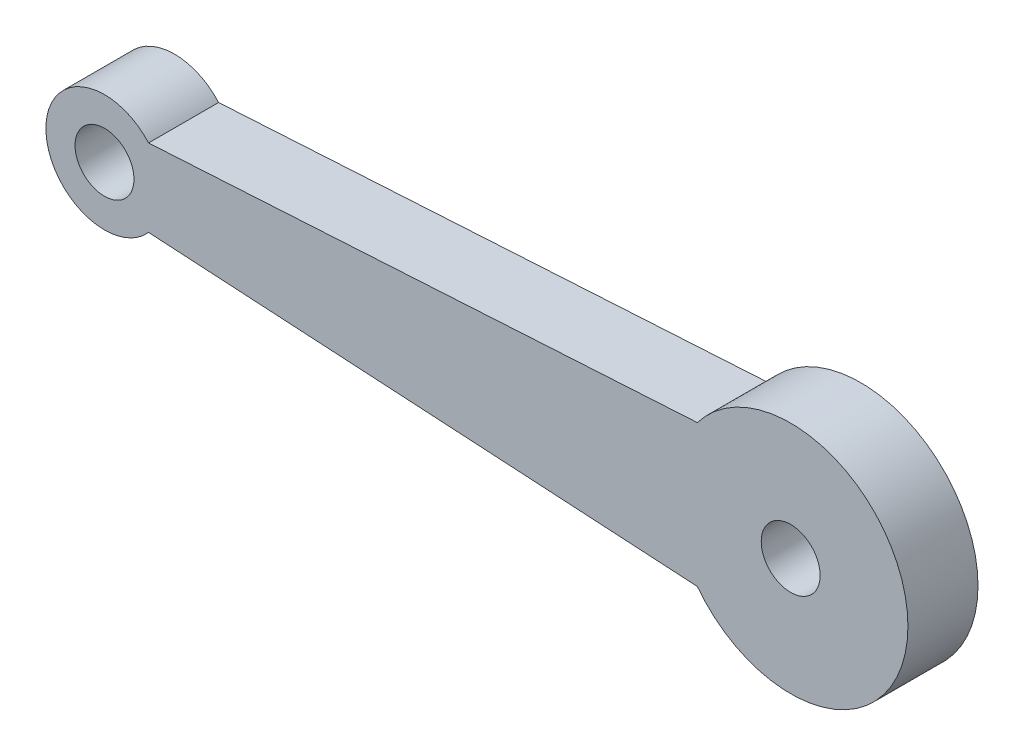
ISO-10303-21;
HEADER;
FILE_DESCRIPTION(('STEP AP214'),'2;1');
FILE_NAME('part.step','',(''),(''),'','','');
FILE_SCHEMA(('AUTOMOTIVE_DESIGN { 1 0 10303 214 1 1 1 1 }'));
ENDSEC;
DATA;
#1=APPLICATION_CONTEXT('core data for automotive mechanical design processes');
#2=APPLICATION_PROTOCOL_DEFINITION('international standard','automotive_design',2000,#1);
#3=PRODUCT_CONTEXT('',#1,'mechanical');
#4=PRODUCT('Part','Part','',(#3));
#5=PRODUCT_RELATED_PRODUCT_CATEGORY('part','',(#4));
#6=PRODUCT_DEFINITION_FORMATION('','',#4);
#7=PRODUCT_DEFINITION_CONTEXT('part definition',#1,'design');
#8=PRODUCT_DEFINITION('design','',#6,#7);
#9=PRODUCT_DEFINITION_SHAPE('','',#8);
#10=(LENGTH_UNIT() NAMED_UNIT(*) SI_UNIT(.MILLI.,.METRE.));
#11=(NAMED_UNIT(*) PLANE_ANGLE_UNIT() SI_UNIT($,.RADIAN.));
#12=(NAMED_UNIT(*) SI_UNIT($,.STERADIAN.) SOLID_ANGLE_UNIT());
#13=UNCERTAINTY_MEASURE_WITH_UNIT(LENGTH_MEASURE(1.E-05),#10,'distance_accuracy_value','');
#14=(GEOMETRIC_REPRESENTATION_CONTEXT(3) GLOBAL_UNCERTAINTY_ASSIGNED_CONTEXT((#13)) GLOBAL_UNIT_ASSIGNED_CONTEXT((#10,
#11,#12)) REPRESENTATION_CONTEXT('',''));
#15=CARTESIAN_POINT('',(0.,0.,0.));
#16=DIRECTION('',(0.,0.,1.));
#17=DIRECTION('',(1.,0.,0.));
#18=AXIS2_PLACEMENT_3D('',#15,#16,#17);
#19=CARTESIAN_POINT('',(62.4114340365097,0.,11.95));
#20=DIRECTION('',(0.,0.,1.));
#21=DIRECTION('',(1.,0.,0.));
#22=AXIS2_PLACEMENT_3D('',#19,#20,#21);
#23=PLANE('',#22);
#24=CARTESIAN_POINT('',(-54.6218791034903,0.,11.95));
#25=DIRECTION('',(0.,0.,1.));
#26=DIRECTION('',(1.,0.,0.));
#27=AXIS2_PLACEMENT_3D('',#24,#25,#26);
#28=CIRCLE('',#27,5.025);
#29=CARTESIAN_POINT('',(-59.6468791034903,0.,11.95));
#30=VERTEX_POINT('',#29);
#31=EDGE_CURVE('E101',#30,#30,#28,.T.);
#32=ORIENTED_EDGE('',*,*,#31,.F.);
#33=EDGE_LOOP('',(#32));
#34=FACE_BOUND('',#33,.T.);
#35=CARTESIAN_POINT('',(62.4114340365097,0.,11.95));
#36=DIRECTION('',(0.,0.,1.));
#37=DIRECTION('',(1.,0.,0.));
#38=AXIS2_PLACEMENT_3D('',#35,#36,#37);
#39=CIRCLE('',#38,20.);
#40=CARTESIAN_POINT('',(46.4909134998335,-12.1052478636858,11.95));
#41=VERTEX_POINT('',#40);
#42=CARTESIAN_POINT('',(46.4909134998335,12.1052478636858,11.95));
#43=VERTEX_POINT('',#42);
#44=EDGE_CURVE('E86',#41,#43,#39,.T.);
#45=ORIENTED_EDGE('',*,*,#44,.T.);
#46=DIRECTION('',(-0.998278196836834,-0.058656983558639,0.));
#47=VECTOR('',#46,1.);
#48=CARTESIAN_POINT('',(46.4909134998335,12.1052478636858,11.95));
#49=LINE('',#48,#47);
#50=CARTESIAN_POINT('',(-47.1138013339103,6.60520765804821,11.95));
#51=VERTEX_POINT('',#50);
#52=EDGE_CURVE('E81',#43,#51,#49,.T.);
#53=ORIENTED_EDGE('',*,*,#52,.T.);
#54=CARTESIAN_POINT('',(-54.6218791034903,0.,11.95));
#55=DIRECTION('',(0.,0.,1.));
#56=DIRECTION('',(1.,0.,0.));
#57=AXIS2_PLACEMENT_3D('',#54,#55,#56);
#58=CIRCLE('',#57,10.);
#59=CARTESIAN_POINT('',(-47.1138013339103,-6.60520765804821,11.95));
#60=VERTEX_POINT('',#59);
#61=EDGE_CURVE('E84',#51,#60,#58,.T.);
#62=ORIENTED_EDGE('',*,*,#61,.T.);
#63=DIRECTION('',(0.998278196836834,-0.058656983558639,0.));
#64=VECTOR('',#63,1.);
#65=CARTESIAN_POINT('',(46.4909134998335,-12.1052478636858,11.95));
#66=LINE('',#65,#64);
#67=EDGE_CURVE('E51',#60,#41,#66,.T.);
#68=ORIENTED_EDGE('',*,*,#67,.T.);
#69=EDGE_LOOP('',(#45,#53,#62,#68));
#70=FACE_BOUND('',#69,.T.);
#71=CARTESIAN_POINT('',(62.4114340365097,0.,11.95));
#72=DIRECTION('',(0.,0.,1.));
#73=DIRECTION('',(1.,0.,0.));
#74=AXIS2_PLACEMENT_3D('',#71,#72,#73);
#75=CIRCLE('',#74,5.025);
#76=CARTESIAN_POINT('',(57.3864340365097,0.,11.95));
#77=VERTEX_POINT('',#76);
#78=EDGE_CURVE('E116',#77,#77,#75,.T.);
#79=ORIENTED_EDGE('',*,*,#78,.F.);
#80=EDGE_LOOP('',(#79));
#81=FACE_BOUND('',#80,.T.);
#82=ADVANCED_FACE('F34',(#34,#70,#81),#23,.T.);
#83=CARTESIAN_POINT('',(62.4114340365097,0.,0.));
#84=DIRECTION('',(0.,0.,1.));
#85=DIRECTION('',(1.,0.,0.));
#86=AXIS2_PLACEMENT_3D('',#83,#84,#85);
#87=PLANE('',#86);
#88=CARTESIAN_POINT('',(62.4114340365097,0.,0.));
#89=DIRECTION('',(0.,0.,1.));
#90=DIRECTION('',(1.,0.,0.));
#91=AXIS2_PLACEMENT_3D('',#88,#89,#90);
#92=CIRCLE('',#91,20.);
#93=CARTESIAN_POINT('',(46.4909134998335,-12.1052478636858,0.));
#94=VERTEX_POINT('',#93);
#95=CARTESIAN_POINT('',(46.4909134998335,12.1052478636858,0.));
#96=VERTEX_POINT('',#95);
#97=EDGE_CURVE('E98',#94,#96,#92,.T.);
#98=ORIENTED_EDGE('',*,*,#97,.F.);
#99=DIRECTION('',(0.998278196836834,-0.058656983558639,0.));
#100=VECTOR('',#99,1.);
#101=CARTESIAN_POINT('',(46.4909134998335,-12.1052478636858,0.));
#102=LINE('',#101,#100);
#103=CARTESIAN_POINT('',(-47.1138013339103,-6.60520765804821,0.));
#104=VERTEX_POINT('',#103);
#105=EDGE_CURVE('E74',#104,#94,#102,.T.);
#106=ORIENTED_EDGE('',*,*,#105,.F.);
#107=CARTESIAN_POINT('',(-54.6218791034903,0.,0.));
#108=DIRECTION('',(0.,0.,1.));
#109=DIRECTION('',(1.,0.,0.));
#110=AXIS2_PLACEMENT_3D('',#107,#108,#109);
#111=CIRCLE('',#110,10.);
#112=CARTESIAN_POINT('',(-47.1138013339103,6.60520765804821,0.));
#113=VERTEX_POINT('',#112);
#114=EDGE_CURVE('E68',#113,#104,#111,.T.);
#115=ORIENTED_EDGE('',*,*,#114,.F.);
#116=DIRECTION('',(-0.998278196836834,-0.058656983558639,0.));
#117=VECTOR('',#116,1.);
#118=CARTESIAN_POINT('',(46.4909134998335,12.1052478636858,0.));
#119=LINE('',#118,#117);
#120=EDGE_CURVE('E90',#96,#113,#119,.T.);
#121=ORIENTED_EDGE('',*,*,#120,.F.);
#122=EDGE_LOOP('',(#98,#106,#115,#121));
#123=FACE_BOUND('',#122,.T.);
#124=CARTESIAN_POINT('',(-54.6218791034903,0.,0.));
#125=DIRECTION('',(0.,0.,1.));
#126=DIRECTION('',(1.,0.,0.));
#127=AXIS2_PLACEMENT_3D('',#124,#125,#126);
#128=CIRCLE('',#127,5.025);
#129=CARTESIAN_POINT('',(-59.6468791034903,0.,0.));
#130=VERTEX_POINT('',#129);
#131=EDGE_CURVE('E113',#130,#130,#128,.T.);
#132=ORIENTED_EDGE('',*,*,#131,.T.);
#133=EDGE_LOOP('',(#132));
#134=FACE_BOUND('',#133,.T.);
#135=CARTESIAN_POINT('',(62.4114340365097,0.,0.));
#136=DIRECTION('',(0.,0.,1.));
#137=DIRECTION('',(1.,0.,0.));
#138=AXIS2_PLACEMENT_3D('',#135,#136,#137);
#139=CIRCLE('',#138,5.025);
#140=CARTESIAN_POINT('',(57.3864340365097,0.,0.));
#141=VERTEX_POINT('',#140);
#142=EDGE_CURVE('E119',#141,#141,#139,.T.);
#143=ORIENTED_EDGE('',*,*,#142,.T.);
#144=EDGE_LOOP('',(#143));
#145=FACE_BOUND('',#144,.T.);
#146=ADVANCED_FACE('F109',(#123,#134,#145),#87,.F.);
#147=CARTESIAN_POINT('',(62.4114340365097,0.,11.95));
#148=DIRECTION('',(0.,0.,-1.));
#149=DIRECTION('',(-1.,0.,0.));
#150=AXIS2_PLACEMENT_3D('',#147,#148,#149);
#151=CYLINDRICAL_SURFACE('',#150,20.);
#152=ORIENTED_EDGE('',*,*,#97,.T.);
#153=DIRECTION('',(0.,0.,-1.));
#154=VECTOR('',#153,1.);
#155=CARTESIAN_POINT('',(46.4909134998335,12.1052478636858,11.95));
#156=LINE('',#155,#154);
#157=EDGE_CURVE('E11',#43,#96,#156,.T.);
#158=ORIENTED_EDGE('',*,*,#157,.F.);
#159=ORIENTED_EDGE('',*,*,#44,.F.);
#160=DIRECTION('',(0.,0.,-1.));
#161=VECTOR('',#160,1.);
#162=CARTESIAN_POINT('',(46.4909134998335,-12.1052478636858,11.95));
#163=LINE('',#162,#161);
#164=EDGE_CURVE('E94',#41,#94,#163,.T.);
#165=ORIENTED_EDGE('',*,*,#164,.T.);
#166=EDGE_LOOP('',(#152,#158,#159,#165));
#167=FACE_BOUND('',#166,.T.);
#168=ADVANCED_FACE('F36',(#167),#151,.T.);
#169=CARTESIAN_POINT('',(46.4909134998335,12.1052478636858,11.95));
#170=DIRECTION('',(0.058656983558639,-0.998278196836834,0.));
#171=DIRECTION('',(0.998278196836835,0.058656983558639,0.));
#172=AXIS2_PLACEMENT_3D('',#169,#170,#171);
#173=PLANE('',#172);
#174=ORIENTED_EDGE('',*,*,#120,.T.);
#175=DIRECTION('',(0.,0.,-1.));
#176=VECTOR('',#175,1.);
#177=CARTESIAN_POINT('',(-47.1138013339103,6.60520765804821,11.95));
#178=LINE('',#177,#176);
#179=EDGE_CURVE('E43',#51,#113,#178,.T.);
#180=ORIENTED_EDGE('',*,*,#179,.F.);
#181=ORIENTED_EDGE('',*,*,#52,.F.);
#182=ORIENTED_EDGE('',*,*,#157,.T.);
#183=EDGE_LOOP('',(#174,#180,#181,#182));
#184=FACE_BOUND('',#183,.T.);
#185=ADVANCED_FACE('F89',(#184),#173,.F.);
#186=CARTESIAN_POINT('',(-54.6218791034903,0.,11.95));
#187=DIRECTION('',(0.,0.,-1.));
#188=DIRECTION('',(-1.,0.,0.));
#189=AXIS2_PLACEMENT_3D('',#186,#187,#188);
#190=CYLINDRICAL_SURFACE('',#189,10.);
#191=ORIENTED_EDGE('',*,*,#114,.T.);
#192=DIRECTION('',(0.,0.,-1.));
#193=VECTOR('',#192,1.);
#194=CARTESIAN_POINT('',(-47.1138013339103,-6.60520765804821,11.95));
#195=LINE('',#194,#193);
#196=EDGE_CURVE('E91',#60,#104,#195,.T.);
#197=ORIENTED_EDGE('',*,*,#196,.F.);
#198=ORIENTED_EDGE('',*,*,#61,.F.);
#199=ORIENTED_EDGE('',*,*,#179,.T.);
#200=EDGE_LOOP('',(#191,#197,#198,#199));
#201=FACE_BOUND('',#200,.T.);
#202=ADVANCED_FACE('F92',(#201),#190,.T.);
#203=CARTESIAN_POINT('',(46.4909134998335,-12.1052478636858,11.95));
#204=DIRECTION('',(0.058656983558639,0.998278196836834,0.));
#205=DIRECTION('',(-0.998278196836835,0.058656983558639,0.));
#206=AXIS2_PLACEMENT_3D('',#203,#204,#205);
#207=PLANE('',#206);
#208=ORIENTED_EDGE('',*,*,#105,.T.);
#209=ORIENTED_EDGE('',*,*,#164,.F.);
#210=ORIENTED_EDGE('',*,*,#67,.F.);
#211=ORIENTED_EDGE('',*,*,#196,.T.);
#212=EDGE_LOOP('',(#208,#209,#210,#211));
#213=FACE_BOUND('',#212,.T.);
#214=ADVANCED_FACE('F106',(#213),#207,.F.);
#215=CARTESIAN_POINT('',(-54.6218791034903,0.,11.95));
#216=DIRECTION('',(0.,0.,-1.));
#217=DIRECTION('',(-1.,0.,0.));
#218=AXIS2_PLACEMENT_3D('',#215,#216,#217);
#219=CYLINDRICAL_SURFACE('',#218,5.025);
#220=CARTESIAN_POINT('',(-59.6468791034903,0.,11.95));
#221=CARTESIAN_POINT('',(-59.6468791034903,0.,11.8255208333333));
#222=CARTESIAN_POINT('',(-59.6468791034903,0.,11.7010416666667));
#223=CARTESIAN_POINT('',(-59.6468791034903,0.,11.4520833333333));
#224=CARTESIAN_POINT('',(-59.6468791034903,0.,11.3276041666667));
#225=CARTESIAN_POINT('',(-59.6468791034903,0.,11.0786458333333));
#226=CARTESIAN_POINT('',(-59.6468791034903,0.,10.9541666666667));
#227=CARTESIAN_POINT('',(-59.6468791034903,0.,10.7052083333333));
#228=CARTESIAN_POINT('',(-59.6468791034903,0.,10.5807291666667));
#229=CARTESIAN_POINT('',(-59.6468791034903,0.,10.3317708333333));
#230=CARTESIAN_POINT('',(-59.6468791034903,0.,10.2072916666667));
#231=CARTESIAN_POINT('',(-59.6468791034903,0.,9.95833333333333));
#232=CARTESIAN_POINT('',(-59.6468791034903,0.,9.83385416666667));
#233=CARTESIAN_POINT('',(-59.6468791034903,0.,9.58489583333333));
#234=CARTESIAN_POINT('',(-59.6468791034903,0.,9.46041666666667));
#235=CARTESIAN_POINT('',(-59.6468791034903,0.,9.21145833333333));
#236=CARTESIAN_POINT('',(-59.6468791034903,0.,9.08697916666667));
#237=CARTESIAN_POINT('',(-59.6468791034903,0.,8.83802083333333));
#238=CARTESIAN_POINT('',(-59.6468791034903,0.,8.71354166666666));
#239=CARTESIAN_POINT('',(-59.6468791034903,0.,8.46458333333333));
#240=CARTESIAN_POINT('',(-59.6468791034903,0.,8.34010416666666));
#241=CARTESIAN_POINT('',(-59.6468791034903,0.,8.09114583333333));
#242=CARTESIAN_POINT('',(-59.6468791034903,0.,7.96666666666667));
#243=CARTESIAN_POINT('',(-59.6468791034903,0.,7.71770833333333));
#244=CARTESIAN_POINT('',(-59.6468791034903,0.,7.59322916666667));
#245=CARTESIAN_POINT('',(-59.6468791034903,0.,7.34427083333333));
#246=CARTESIAN_POINT('',(-59.6468791034903,0.,7.21979166666666));
#247=CARTESIAN_POINT('',(-59.6468791034903,0.,6.97083333333333));
#248=CARTESIAN_POINT('',(-59.6468791034903,0.,6.84635416666667));
#249=CARTESIAN_POINT('',(-59.6468791034903,0.,6.59739583333333));
#250=CARTESIAN_POINT('',(-59.6468791034903,0.,6.47291666666666));
#251=CARTESIAN_POINT('',(-59.6468791034903,0.,6.22395833333333));
#252=CARTESIAN_POINT('',(-59.6468791034903,0.,6.09947916666667));
#253=CARTESIAN_POINT('',(-59.6468791034903,0.,5.85052083333333));
#254=CARTESIAN_POINT('',(-59.6468791034903,0.,5.72604166666667));
#255=CARTESIAN_POINT('',(-59.6468791034903,0.,5.47708333333333));
#256=CARTESIAN_POINT('',(-59.6468791034903,0.,5.35260416666666));
#257=CARTESIAN_POINT('',(-59.6468791034903,0.,5.10364583333333));
#258=CARTESIAN_POINT('',(-59.6468791034903,0.,4.97916666666667));
#259=CARTESIAN_POINT('',(-59.6468791034903,0.,4.73020833333333));
#260=CARTESIAN_POINT('',(-59.6468791034903,0.,4.60572916666666));
#261=CARTESIAN_POINT('',(-59.6468791034903,0.,4.35677083333333));
#262=CARTESIAN_POINT('',(-59.6468791034903,0.,4.23229166666667));
#263=CARTESIAN_POINT('',(-59.6468791034903,0.,3.98333333333333));
#264=CARTESIAN_POINT('',(-59.6468791034903,0.,3.85885416666666));
#265=CARTESIAN_POINT('',(-59.6468791034903,0.,3.60989583333333));
#266=CARTESIAN_POINT('',(-59.6468791034903,0.,3.48541666666666));
#267=CARTESIAN_POINT('',(-59.6468791034903,0.,3.23645833333333));
#268=CARTESIAN_POINT('',(-59.6468791034903,0.,3.11197916666667));
#269=CARTESIAN_POINT('',(-59.6468791034903,0.,2.86302083333333));
#270=CARTESIAN_POINT('',(-59.6468791034903,0.,2.73854166666667));
#271=CARTESIAN_POINT('',(-59.6468791034903,0.,2.48958333333333));
#272=CARTESIAN_POINT('',(-59.6468791034903,0.,2.36510416666666));
#273=CARTESIAN_POINT('',(-59.6468791034903,0.,2.11614583333333));
#274=CARTESIAN_POINT('',(-59.6468791034903,0.,1.99166666666667));
#275=CARTESIAN_POINT('',(-59.6468791034903,0.,1.74270833333333));
#276=CARTESIAN_POINT('',(-59.6468791034903,0.,1.61822916666667));
#277=CARTESIAN_POINT('',(-59.6468791034903,0.,1.36927083333333));
#278=CARTESIAN_POINT('',(-59.6468791034903,0.,1.24479166666666));
#279=CARTESIAN_POINT('',(-59.6468791034903,0.,0.995833333333331));
#280=CARTESIAN_POINT('',(-59.6468791034903,0.,0.871354166666664));
#281=CARTESIAN_POINT('',(-59.6468791034903,0.,0.622395833333331));
#282=CARTESIAN_POINT('',(-59.6468791034903,0.,0.497916666666665));
#283=CARTESIAN_POINT('',(-59.6468791034903,0.,0.248958333333332));
#284=CARTESIAN_POINT('',(-59.6468791034903,0.,0.124479166666665));
#285=CARTESIAN_POINT('',(-59.6468791034903,0.,0.));
#286=B_SPLINE_CURVE_WITH_KNOTS('',3,(#220,#221,#222,#223,#224,#225,#226,#227,#228,#229,#230,
#231,#232,#233,#234,#235,#236,#237,#238,#239,#240,#241,#242,#243,#244,#245,#246,#247,#248,#249,
#250,#251,#252,#253,#254,#255,#256,#257,#258,#259,#260,#261,#262,#263,#264,#265,#266,#267,#268,
#269,#270,#271,#272,#273,#274,#275,#276,#277,#278,#279,#280,#281,#282,#283,#284,#285),
.UNSPECIFIED.,.F.,.F.,(4,2,2,2,2,2,2,2,2,2,2,2,2,2,2,2,2,2,2,2,2,2,2,2,2,2,2,2,2,2,2,2,4),(0.,
0.373437499999999,0.746874999999999,1.1203125,1.49375,1.8671875,2.240625,2.6140625,2.9875,
3.3609375,3.734375,4.1078125,4.48125,4.8546875,5.228125,5.6015625,5.975,6.3484375,6.721875,
7.0953125,7.46875,7.8421875,8.215625,8.5890625,8.9625,9.3359375,9.709375,10.0828125,10.45625,
10.8296875,11.203125,11.5765625,11.95),.UNSPECIFIED.);
#287=EDGE_CURVE('BSEAM136',#30,#130,#286,.T.);
#288=ORIENTED_EDGE('',*,*,#31,.T.);
#289=ORIENTED_EDGE('',*,*,#131,.F.);
#290=ORIENTED_EDGE('',*,*,#287,.T.);
#291=ORIENTED_EDGE('',*,*,#287,.F.);
#292=EDGE_LOOP('',(#288,#290,#289,#291));
#293=FACE_BOUND('',#292,.T.);
#294=ADVANCED_FACE('F136',(#293),#219,.F.);
#295=CARTESIAN_POINT('',(62.4114340365097,0.,11.95));
#296=DIRECTION('',(0.,0.,-1.));
#297=DIRECTION('',(-1.,0.,0.));
#298=AXIS2_PLACEMENT_3D('',#295,#296,#297);
#299=CYLINDRICAL_SURFACE('',#298,5.025);
#300=CARTESIAN_POINT('',(57.3864340365097,0.,11.95));
#301=CARTESIAN_POINT('',(57.3864340365097,0.,11.8255208333333));
#302=CARTESIAN_POINT('',(57.3864340365097,0.,11.7010416666667));
#303=CARTESIAN_POINT('',(57.3864340365097,0.,11.4520833333333));
#304=CARTESIAN_POINT('',(57.3864340365097,0.,11.3276041666667));
#305=CARTESIAN_POINT('',(57.3864340365097,0.,11.0786458333333));
#306=CARTESIAN_POINT('',(57.3864340365097,0.,10.9541666666667));
#307=CARTESIAN_POINT('',(57.3864340365097,0.,10.7052083333333));
#308=CARTESIAN_POINT('',(57.3864340365097,0.,10.5807291666667));
#309=CARTESIAN_POINT('',(57.3864340365097,0.,10.3317708333333));
#310=CARTESIAN_POINT('',(57.3864340365097,0.,10.2072916666667));
#311=CARTESIAN_POINT('',(57.3864340365097,0.,9.95833333333333));
#312=CARTESIAN_POINT('',(57.3864340365097,0.,9.83385416666667));
#313=CARTESIAN_POINT('',(57.3864340365097,0.,9.58489583333333));
#314=CARTESIAN_POINT('',(57.3864340365097,0.,9.46041666666667));
#315=CARTESIAN_POINT('',(57.3864340365097,0.,9.21145833333333));
#316=CARTESIAN_POINT('',(57.3864340365097,0.,9.08697916666667));
#317=CARTESIAN_POINT('',(57.3864340365097,0.,8.83802083333333));
#318=CARTESIAN_POINT('',(57.3864340365097,0.,8.71354166666666));
#319=CARTESIAN_POINT('',(57.3864340365097,0.,8.46458333333333));
#320=CARTESIAN_POINT('',(57.3864340365097,0.,8.34010416666666));
#321=CARTESIAN_POINT('',(57.3864340365097,0.,8.09114583333333));
#322=CARTESIAN_POINT('',(57.3864340365097,0.,7.96666666666667));
#323=CARTESIAN_POINT('',(57.3864340365097,0.,7.71770833333333));
#324=CARTESIAN_POINT('',(57.3864340365097,0.,7.59322916666667));
#325=CARTESIAN_POINT('',(57.3864340365097,0.,7.34427083333333));
#326=CARTESIAN_POINT('',(57.3864340365097,0.,7.21979166666666));
#327=CARTESIAN_POINT('',(57.3864340365097,0.,6.97083333333333));
#328=CARTESIAN_POINT('',(57.3864340365097,0.,6.84635416666667));
#329=CARTESIAN_POINT('',(57.3864340365097,0.,6.59739583333333));
#330=CARTESIAN_POINT('',(57.3864340365097,0.,6.47291666666666));
#331=CARTESIAN_POINT('',(57.3864340365097,0.,6.22395833333333));
#332=CARTESIAN_POINT('',(57.3864340365097,0.,6.09947916666667));
#333=CARTESIAN_POINT('',(57.3864340365097,0.,5.85052083333333));
#334=CARTESIAN_POINT('',(57.3864340365097,0.,5.72604166666667));
#335=CARTESIAN_POINT('',(57.3864340365097,0.,5.47708333333333));
#336=CARTESIAN_POINT('',(57.3864340365097,0.,5.35260416666666));
#337=CARTESIAN_POINT('',(57.3864340365097,0.,5.10364583333333));
#338=CARTESIAN_POINT('',(57.3864340365097,0.,4.97916666666667));
#339=CARTESIAN_POINT('',(57.3864340365097,0.,4.73020833333333));
#340=CARTESIAN_POINT('',(57.3864340365097,0.,4.60572916666666));
#341=CARTESIAN_POINT('',(57.3864340365097,0.,4.35677083333333));
#342=CARTESIAN_POINT('',(57.3864340365097,0.,4.23229166666667));
#343=CARTESIAN_POINT('',(57.3864340365097,0.,3.98333333333333));
#344=CARTESIAN_POINT('',(57.3864340365097,0.,3.85885416666666));
#345=CARTESIAN_POINT('',(57.3864340365097,0.,3.60989583333333));
#346=CARTESIAN_POINT('',(57.3864340365097,0.,3.48541666666666));
#347=CARTESIAN_POINT('',(57.3864340365097,0.,3.23645833333333));
#348=CARTESIAN_POINT('',(57.3864340365097,0.,3.11197916666667));
#349=CARTESIAN_POINT('',(57.3864340365097,0.,2.86302083333333));
#350=CARTESIAN_POINT('',(57.3864340365097,0.,2.73854166666667));
#351=CARTESIAN_POINT('',(57.3864340365097,0.,2.48958333333333));
#352=CARTESIAN_POINT('',(57.3864340365097,0.,2.36510416666666));
#353=CARTESIAN_POINT('',(57.3864340365097,0.,2.11614583333333));
#354=CARTESIAN_POINT('',(57.3864340365097,0.,1.99166666666667));
#355=CARTESIAN_POINT('',(57.3864340365097,0.,1.74270833333333));
#356=CARTESIAN_POINT('',(57.3864340365097,0.,1.61822916666667));
#357=CARTESIAN_POINT('',(57.3864340365097,0.,1.36927083333333));
#358=CARTESIAN_POINT('',(57.3864340365097,0.,1.24479166666666));
#359=CARTESIAN_POINT('',(57.3864340365097,0.,0.995833333333331));
#360=CARTESIAN_POINT('',(57.3864340365097,0.,0.871354166666664));
#361=CARTESIAN_POINT('',(57.3864340365097,0.,0.622395833333331));
#362=CARTESIAN_POINT('',(57.3864340365097,0.,0.497916666666665));
#363=CARTESIAN_POINT('',(57.3864340365097,0.,0.248958333333332));
#364=CARTESIAN_POINT('',(57.3864340365097,0.,0.124479166666665));
#365=CARTESIAN_POINT('',(57.3864340365097,0.,0.));
#366=B_SPLINE_CURVE_WITH_KNOTS('',3,(#300,#301,#302,#303,#304,#305,#306,#307,#308,#309,#310,
#311,#312,#313,#314,#315,#316,#317,#318,#319,#320,#321,#322,#323,#324,#325,#326,#327,#328,#329,
#330,#331,#332,#333,#334,#335,#336,#337,#338,#339,#340,#341,#342,#343,#344,#345,#346,#347,#348,
#349,#350,#351,#352,#353,#354,#355,#356,#357,#358,#359,#360,#361,#362,#363,#364,#365),
.UNSPECIFIED.,.F.,.F.,(4,2,2,2,2,2,2,2,2,2,2,2,2,2,2,2,2,2,2,2,2,2,2,2,2,2,2,2,2,2,2,2,4),(0.,
0.373437499999999,0.746874999999999,1.1203125,1.49375,1.8671875,2.240625,2.6140625,2.9875,
3.3609375,3.734375,4.1078125,4.48125,4.8546875,5.228125,5.6015625,5.975,6.3484375,6.721875,
7.0953125,7.46875,7.8421875,8.215625,8.5890625,8.9625,9.3359375,9.709375,10.0828125,10.45625,
10.8296875,11.203125,11.5765625,11.95),.UNSPECIFIED.);
#367=EDGE_CURVE('BSEAM125',#77,#141,#366,.T.);
#368=ORIENTED_EDGE('',*,*,#78,.T.);
#369=ORIENTED_EDGE('',*,*,#142,.F.);
#370=ORIENTED_EDGE('',*,*,#367,.T.);
#371=ORIENTED_EDGE('',*,*,#367,.F.);
#372=EDGE_LOOP('',(#368,#370,#369,#371));
#373=FACE_BOUND('',#372,.T.);
#374=ADVANCED_FACE('F125',(#373),#299,.F.);
#375=CLOSED_SHELL('',(#82,#146,#168,#185,#202,#214,#294,#374));
#376=MANIFOLD_SOLID_BREP('B2',#375);
#377=ADVANCED_BREP_SHAPE_REPRESENTATION('',(#18,#376),#14);
#378=SHAPE_DEFINITION_REPRESENTATION(#9,#377);
ENDSEC;
END-ISO-10303-21;
